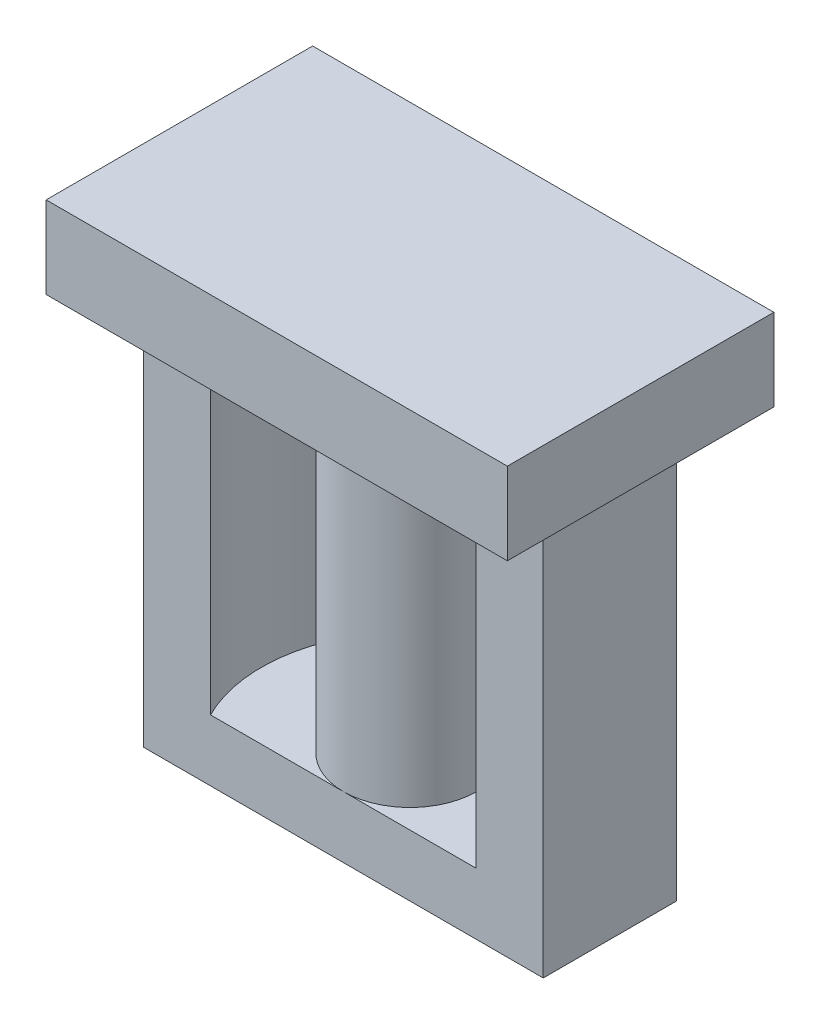
ISO-10303-21;
HEADER;
FILE_DESCRIPTION(('STEP AP214'),'2;1');
FILE_NAME('part.step','',(''),(''),'','','');
FILE_SCHEMA(('AUTOMOTIVE_DESIGN { 1 0 10303 214 1 1 1 1 }'));
ENDSEC;
DATA;
#1=APPLICATION_CONTEXT('core data for automotive mechanical design processes');
#2=APPLICATION_PROTOCOL_DEFINITION('international standard','automotive_design',2000,#1);
#3=PRODUCT_CONTEXT('',#1,'mechanical');
#4=PRODUCT('Part','Part','',(#3));
#5=PRODUCT_RELATED_PRODUCT_CATEGORY('part','',(#4));
#6=PRODUCT_DEFINITION_FORMATION('','',#4);
#7=PRODUCT_DEFINITION_CONTEXT('part definition',#1,'design');
#8=PRODUCT_DEFINITION('design','',#6,#7);
#9=PRODUCT_DEFINITION_SHAPE('','',#8);
#10=(LENGTH_UNIT() NAMED_UNIT(*) SI_UNIT(.MILLI.,.METRE.));
#11=(NAMED_UNIT(*) PLANE_ANGLE_UNIT() SI_UNIT($,.RADIAN.));
#12=(NAMED_UNIT(*) SI_UNIT($,.STERADIAN.) SOLID_ANGLE_UNIT());
#13=UNCERTAINTY_MEASURE_WITH_UNIT(LENGTH_MEASURE(1.E-05),#10,'distance_accuracy_value','');
#14=(GEOMETRIC_REPRESENTATION_CONTEXT(3) GLOBAL_UNCERTAINTY_ASSIGNED_CONTEXT((#13)) GLOBAL_UNIT_ASSIGNED_CONTEXT((#10,
#11,#12)) REPRESENTATION_CONTEXT('',''));
#15=CARTESIAN_POINT('',(0.,0.,0.));
#16=DIRECTION('',(0.,0.,1.));
#17=DIRECTION('',(1.,0.,0.));
#18=AXIS2_PLACEMENT_3D('',#15,#16,#17);
#19=CARTESIAN_POINT('',(0.,0.,0.));
#20=DIRECTION('',(0.,-1.,0.));
#21=DIRECTION('',(0.,0.,-1.));
#22=AXIS2_PLACEMENT_3D('',#19,#20,#21);
#23=PLANE('',#22);
#24=CARTESIAN_POINT('',(19.5,0.,-6.5));
#25=DIRECTION('',(0.,-1.,0.));
#26=DIRECTION('',(0.,0.,-1.));
#27=AXIS2_PLACEMENT_3D('',#24,#25,#26);
#28=CIRCLE('',#27,6.50000000000001);
#29=CARTESIAN_POINT('',(19.5,0.,-13.));
#30=VERTEX_POINT('',#29);
#31=CARTESIAN_POINT('',(19.5,0.,0.));
#32=VERTEX_POINT('',#31);
#33=EDGE_CURVE('E11',#30,#32,#28,.F.);
#34=ORIENTED_EDGE('',*,*,#33,.F.);
#35=DIRECTION('',(1.,0.,0.));
#36=VECTOR('',#35,1.);
#37=CARTESIAN_POINT('',(0.,0.,-13.));
#38=LINE('',#37,#36);
#39=CARTESIAN_POINT('',(6.53851860318428,0.,-13.));
#40=VERTEX_POINT('',#39);
#41=EDGE_CURVE('E219',#40,#30,#38,.T.);
#42=ORIENTED_EDGE('',*,*,#41,.F.);
#43=CARTESIAN_POINT('',(19.5,0.,-6.5));
#44=DIRECTION('',(0.,1.,0.));
#45=DIRECTION('',(0.,0.,1.));
#46=AXIS2_PLACEMENT_3D('',#43,#44,#45);
#47=CIRCLE('',#46,14.5);
#48=CARTESIAN_POINT('',(6.53851860318428,0.,0.));
#49=VERTEX_POINT('',#48);
#50=EDGE_CURVE('E226',#40,#49,#47,.T.);
#51=ORIENTED_EDGE('',*,*,#50,.T.);
#52=DIRECTION('',(-1.,0.,0.));
#53=VECTOR('',#52,1.);
#54=CARTESIAN_POINT('',(0.,0.,0.));
#55=LINE('',#54,#53);
#56=EDGE_CURVE('E221',#32,#49,#55,.T.);
#57=ORIENTED_EDGE('',*,*,#56,.F.);
#58=EDGE_LOOP('',(#34,#42,#51,#57));
#59=FACE_BOUND('',#58,.T.);
#60=ADVANCED_FACE('F38',(#59),#23,.F.);
#61=CARTESIAN_POINT('',(19.5,14.,-6.5));
#62=DIRECTION('',(0.,-1.,0.));
#63=DIRECTION('',(0.,0.,-1.));
#64=AXIS2_PLACEMENT_3D('',#61,#62,#63);
#65=CYLINDRICAL_SURFACE('',#64,14.5);
#66=ORIENTED_EDGE('',*,*,#50,.F.);
#67=DIRECTION('',(0.,-1.,0.));
#68=VECTOR('',#67,1.);
#69=CARTESIAN_POINT('',(6.53851860318428,14.,-13.));
#70=LINE('',#69,#68);
#71=CARTESIAN_POINT('',(6.53851860318428,28.,-13.));
#72=VERTEX_POINT('',#71);
#73=EDGE_CURVE('E46',#72,#40,#70,.T.);
#74=ORIENTED_EDGE('',*,*,#73,.F.);
#75=CARTESIAN_POINT('',(19.5,28.,-6.5));
#76=DIRECTION('',(0.,-1.,0.));
#77=DIRECTION('',(0.,0.,1.));
#78=AXIS2_PLACEMENT_3D('',#75,#76,#77);
#79=CIRCLE('',#78,14.5);
#80=CARTESIAN_POINT('',(6.53851860318428,28.,0.));
#81=VERTEX_POINT('',#80);
#82=EDGE_CURVE('E189',#81,#72,#79,.T.);
#83=ORIENTED_EDGE('',*,*,#82,.F.);
#84=DIRECTION('',(0.,-1.,0.));
#85=VECTOR('',#84,1.);
#86=CARTESIAN_POINT('',(6.53851860318428,14.,0.));
#87=LINE('',#86,#85);
#88=EDGE_CURVE('E229',#81,#49,#87,.T.);
#89=ORIENTED_EDGE('',*,*,#88,.T.);
#90=EDGE_LOOP('',(#66,#74,#83,#89));
#91=FACE_BOUND('',#90,.T.);
#92=ADVANCED_FACE('F40',(#91),#65,.F.);
#93=CARTESIAN_POINT('',(0.,14.,-13.));
#94=DIRECTION('',(0.,0.,-1.));
#95=DIRECTION('',(-1.,0.,0.));
#96=AXIS2_PLACEMENT_3D('',#93,#94,#95);
#97=PLANE('',#96);
#98=DIRECTION('',(0.,-1.,0.));
#99=VECTOR('',#98,1.);
#100=CARTESIAN_POINT('',(32.4614813968157,14.,-13.));
#101=LINE('',#100,#99);
#102=CARTESIAN_POINT('',(32.4614813968157,28.,-13.));
#103=VERTEX_POINT('',#102);
#104=CARTESIAN_POINT('',(32.4614813968157,0.,-13.));
#105=VERTEX_POINT('',#104);
#106=EDGE_CURVE('E200',#103,#105,#101,.T.);
#107=ORIENTED_EDGE('',*,*,#106,.F.);
#108=DIRECTION('',(-1.,0.,0.));
#109=VECTOR('',#108,1.);
#110=CARTESIAN_POINT('',(0.,28.,-13.));
#111=LINE('',#110,#109);
#112=CARTESIAN_POINT('',(19.5,28.,-13.));
#113=VERTEX_POINT('',#112);
#114=EDGE_CURVE('E177',#103,#113,#111,.T.);
#115=ORIENTED_EDGE('',*,*,#114,.T.);
#116=EDGE_CURVE('E186',#113,#72,#111,.T.);
#117=ORIENTED_EDGE('',*,*,#116,.T.);
#118=ORIENTED_EDGE('',*,*,#73,.T.);
#119=ORIENTED_EDGE('',*,*,#41,.T.);
#120=EDGE_CURVE('E207',#30,#105,#38,.T.);
#121=ORIENTED_EDGE('',*,*,#120,.T.);
#122=EDGE_LOOP('',(#107,#115,#117,#118,#119,#121));
#123=FACE_BOUND('',#122,.T.);
#124=DIRECTION('',(-1.,0.,0.));
#125=VECTOR('',#124,1.);
#126=CARTESIAN_POINT('',(0.,34.,-13.));
#127=LINE('',#126,#125);
#128=CARTESIAN_POINT('',(39.,34.,-13.));
#129=VERTEX_POINT('',#128);
#130=CARTESIAN_POINT('',(0.,34.,-13.));
#131=VERTEX_POINT('',#130);
#132=EDGE_CURVE('E183',#129,#131,#127,.T.);
#133=ORIENTED_EDGE('',*,*,#132,.F.);
#134=DIRECTION('',(0.,1.,0.));
#135=VECTOR('',#134,1.);
#136=CARTESIAN_POINT('',(39.,-6.,-13.));
#137=LINE('',#136,#135);
#138=CARTESIAN_POINT('',(39.,-6.,-13.));
#139=VERTEX_POINT('',#138);
#140=EDGE_CURVE('E224',#139,#129,#137,.T.);
#141=ORIENTED_EDGE('',*,*,#140,.F.);
#142=DIRECTION('',(1.,0.,0.));
#143=VECTOR('',#142,1.);
#144=CARTESIAN_POINT('',(0.,-6.,-13.));
#145=LINE('',#144,#143);
#146=CARTESIAN_POINT('',(0.,-6.,-13.));
#147=VERTEX_POINT('',#146);
#148=EDGE_CURVE('E211',#147,#139,#145,.T.);
#149=ORIENTED_EDGE('',*,*,#148,.F.);
#150=DIRECTION('',(0.,-1.,0.));
#151=VECTOR('',#150,1.);
#152=CARTESIAN_POINT('',(0.,14.,-13.));
#153=LINE('',#152,#151);
#154=EDGE_CURVE('E234',#131,#147,#153,.T.);
#155=ORIENTED_EDGE('',*,*,#154,.F.);
#156=EDGE_LOOP('',(#133,#141,#149,#155));
#157=FACE_BOUND('',#156,.T.);
#158=ADVANCED_FACE('F238',(#123,#157),#97,.T.);
#159=CARTESIAN_POINT('',(0.,14.,0.));
#160=DIRECTION('',(-1.,0.,0.));
#161=DIRECTION('',(0.,0.,1.));
#162=AXIS2_PLACEMENT_3D('',#159,#160,#161);
#163=PLANE('',#162);
#164=ORIENTED_EDGE('',*,*,#154,.T.);
#165=DIRECTION('',(0.,0.,-1.));
#166=VECTOR('',#165,1.);
#167=CARTESIAN_POINT('',(0.,-6.,0.));
#168=LINE('',#167,#166);
#169=CARTESIAN_POINT('',(0.,-6.,0.));
#170=VERTEX_POINT('',#169);
#171=EDGE_CURVE('E208',#170,#147,#168,.T.);
#172=ORIENTED_EDGE('',*,*,#171,.F.);
#173=DIRECTION('',(0.,-1.,0.));
#174=VECTOR('',#173,1.);
#175=CARTESIAN_POINT('',(0.,14.,0.));
#176=LINE('',#175,#174);
#177=CARTESIAN_POINT('',(0.,34.,0.));
#178=VERTEX_POINT('',#177);
#179=EDGE_CURVE('E232',#178,#170,#176,.T.);
#180=ORIENTED_EDGE('',*,*,#179,.F.);
#181=DIRECTION('',(0.,0.,1.));
#182=VECTOR('',#181,1.);
#183=CARTESIAN_POINT('',(0.,34.,-13.));
#184=LINE('',#183,#182);
#185=EDGE_CURVE('E173',#131,#178,#184,.T.);
#186=ORIENTED_EDGE('',*,*,#185,.F.);
#187=EDGE_LOOP('',(#164,#172,#180,#186));
#188=FACE_BOUND('',#187,.T.);
#189=ADVANCED_FACE('F289',(#188),#163,.T.);
#190=CARTESIAN_POINT('',(0.,14.,0.));
#191=DIRECTION('',(0.,0.,-1.));
#192=DIRECTION('',(-1.,0.,0.));
#193=AXIS2_PLACEMENT_3D('',#190,#191,#192);
#194=PLANE('',#193);
#195=DIRECTION('',(0.,1.,0.));
#196=VECTOR('',#195,1.);
#197=CARTESIAN_POINT('',(39.,-6.,0.));
#198=LINE('',#197,#196);
#199=CARTESIAN_POINT('',(39.,-6.,0.));
#200=VERTEX_POINT('',#199);
#201=CARTESIAN_POINT('',(39.,34.,0.));
#202=VERTEX_POINT('',#201);
#203=EDGE_CURVE('E218',#200,#202,#198,.T.);
#204=ORIENTED_EDGE('',*,*,#203,.T.);
#205=DIRECTION('',(1.,0.,0.));
#206=VECTOR('',#205,1.);
#207=CARTESIAN_POINT('',(0.,34.,0.));
#208=LINE('',#207,#206);
#209=EDGE_CURVE('E176',#178,#202,#208,.T.);
#210=ORIENTED_EDGE('',*,*,#209,.F.);
#211=ORIENTED_EDGE('',*,*,#179,.T.);
#212=DIRECTION('',(-1.,0.,0.));
#213=VECTOR('',#212,1.);
#214=CARTESIAN_POINT('',(0.,-6.,0.));
#215=LINE('',#214,#213);
#216=EDGE_CURVE('E215',#200,#170,#215,.T.);
#217=ORIENTED_EDGE('',*,*,#216,.F.);
#218=EDGE_LOOP('',(#204,#210,#211,#217));
#219=FACE_BOUND('',#218,.T.);
#220=DIRECTION('',(1.,0.,0.));
#221=VECTOR('',#220,1.);
#222=CARTESIAN_POINT('',(0.,28.,0.));
#223=LINE('',#222,#221);
#224=CARTESIAN_POINT('',(19.5,28.,0.));
#225=VERTEX_POINT('',#224);
#226=CARTESIAN_POINT('',(32.4614813968157,28.,0.));
#227=VERTEX_POINT('',#226);
#228=EDGE_CURVE('E164',#225,#227,#223,.T.);
#229=ORIENTED_EDGE('',*,*,#228,.T.);
#230=DIRECTION('',(0.,-1.,0.));
#231=VECTOR('',#230,1.);
#232=CARTESIAN_POINT('',(32.4614813968157,14.,0.));
#233=LINE('',#232,#231);
#234=CARTESIAN_POINT('',(32.4614813968157,0.,0.));
#235=VERTEX_POINT('',#234);
#236=EDGE_CURVE('E202',#227,#235,#233,.T.);
#237=ORIENTED_EDGE('',*,*,#236,.T.);
#238=EDGE_CURVE('E60',#235,#32,#55,.T.);
#239=ORIENTED_EDGE('',*,*,#238,.T.);
#240=ORIENTED_EDGE('',*,*,#56,.T.);
#241=ORIENTED_EDGE('',*,*,#88,.F.);
#242=EDGE_CURVE('E167',#81,#225,#223,.T.);
#243=ORIENTED_EDGE('',*,*,#242,.T.);
#244=EDGE_LOOP('',(#229,#237,#239,#240,#241,#243));
#245=FACE_BOUND('',#244,.T.);
#246=ADVANCED_FACE('F264',(#219,#245),#194,.F.);
#247=ORIENTED_EDGE('',*,*,#238,.F.);
#248=CARTESIAN_POINT('',(19.5,0.,-6.5));
#249=DIRECTION('',(0.,1.,0.));
#250=DIRECTION('',(0.,0.,1.));
#251=AXIS2_PLACEMENT_3D('',#248,#249,#250);
#252=CIRCLE('',#251,14.5);
#253=EDGE_CURVE('E197',#235,#105,#252,.T.);
#254=ORIENTED_EDGE('',*,*,#253,.T.);
#255=ORIENTED_EDGE('',*,*,#120,.F.);
#256=CARTESIAN_POINT('',(19.5,0.,-6.5));
#257=DIRECTION('',(0.,1.,0.));
#258=DIRECTION('',(0.,0.,1.));
#259=AXIS2_PLACEMENT_3D('',#256,#257,#258);
#260=CIRCLE('',#259,6.50000000000001);
#261=EDGE_CURVE('E204',#32,#30,#260,.T.);
#262=ORIENTED_EDGE('',*,*,#261,.F.);
#263=EDGE_LOOP('',(#247,#254,#255,#262));
#264=FACE_BOUND('',#263,.T.);
#265=ADVANCED_FACE('F253',(#264),#23,.F.);
#266=CARTESIAN_POINT('',(39.,-6.,0.));
#267=DIRECTION('',(-1.,0.,0.));
#268=DIRECTION('',(0.,0.,1.));
#269=AXIS2_PLACEMENT_3D('',#266,#267,#268);
#270=PLANE('',#269);
#271=ORIENTED_EDGE('',*,*,#140,.T.);
#272=DIRECTION('',(0.,0.,-1.));
#273=VECTOR('',#272,1.);
#274=CARTESIAN_POINT('',(39.,34.,-13.));
#275=LINE('',#274,#273);
#276=EDGE_CURVE('E180',#202,#129,#275,.T.);
#277=ORIENTED_EDGE('',*,*,#276,.F.);
#278=ORIENTED_EDGE('',*,*,#203,.F.);
#279=DIRECTION('',(0.,0.,1.));
#280=VECTOR('',#279,1.);
#281=CARTESIAN_POINT('',(39.,-6.,0.));
#282=LINE('',#281,#280);
#283=EDGE_CURVE('E213',#139,#200,#282,.T.);
#284=ORIENTED_EDGE('',*,*,#283,.F.);
#285=EDGE_LOOP('',(#271,#277,#278,#284));
#286=FACE_BOUND('',#285,.T.);
#287=ADVANCED_FACE('F283',(#286),#270,.F.);
#288=CARTESIAN_POINT('',(0.,-6.,0.));
#289=DIRECTION('',(0.,-1.,0.));
#290=DIRECTION('',(0.,0.,-1.));
#291=AXIS2_PLACEMENT_3D('',#288,#289,#290);
#292=PLANE('',#291);
#293=ORIENTED_EDGE('',*,*,#171,.T.);
#294=ORIENTED_EDGE('',*,*,#148,.T.);
#295=ORIENTED_EDGE('',*,*,#283,.T.);
#296=ORIENTED_EDGE('',*,*,#216,.T.);
#297=EDGE_LOOP('',(#293,#294,#295,#296));
#298=FACE_BOUND('',#297,.T.);
#299=ADVANCED_FACE('F273',(#298),#292,.T.);
#300=CARTESIAN_POINT('',(19.5,14.,-6.5));
#301=DIRECTION('',(0.,-1.,0.));
#302=DIRECTION('',(0.,0.,-1.));
#303=AXIS2_PLACEMENT_3D('',#300,#301,#302);
#304=CYLINDRICAL_SURFACE('',#303,6.50000000000001);
#305=ORIENTED_EDGE('',*,*,#261,.T.);
#306=ORIENTED_EDGE('',*,*,#33,.T.);
#307=EDGE_LOOP('',(#305,#306));
#308=FACE_BOUND('',#307,.T.);
#309=CARTESIAN_POINT('',(19.5,28.,-6.5));
#310=DIRECTION('',(0.,1.,0.));
#311=DIRECTION('',(0.,0.,1.));
#312=AXIS2_PLACEMENT_3D('',#309,#310,#311);
#313=CIRCLE('',#312,6.50000000000001);
#314=EDGE_CURVE('E192',#225,#113,#313,.T.);
#315=ORIENTED_EDGE('',*,*,#314,.F.);
#316=EDGE_CURVE('E52',#113,#225,#313,.T.);
#317=ORIENTED_EDGE('',*,*,#316,.F.);
#318=EDGE_LOOP('',(#315,#317));
#319=FACE_BOUND('',#318,.T.);
#320=ADVANCED_FACE('F251',(#308,#319),#304,.T.);
#321=CARTESIAN_POINT('',(19.5,14.,-6.5));
#322=DIRECTION('',(0.,-1.,0.));
#323=DIRECTION('',(0.,0.,-1.));
#324=AXIS2_PLACEMENT_3D('',#321,#322,#323);
#325=CYLINDRICAL_SURFACE('',#324,14.5);
#326=ORIENTED_EDGE('',*,*,#253,.F.);
#327=ORIENTED_EDGE('',*,*,#236,.F.);
#328=CARTESIAN_POINT('',(19.5,28.,-6.5));
#329=DIRECTION('',(0.,-1.,0.));
#330=DIRECTION('',(0.,0.,1.));
#331=AXIS2_PLACEMENT_3D('',#328,#329,#330);
#332=CIRCLE('',#331,14.5);
#333=EDGE_CURVE('E194',#103,#227,#332,.T.);
#334=ORIENTED_EDGE('',*,*,#333,.F.);
#335=ORIENTED_EDGE('',*,*,#106,.T.);
#336=EDGE_LOOP('',(#326,#327,#334,#335));
#337=FACE_BOUND('',#336,.T.);
#338=ADVANCED_FACE('F265',(#337),#325,.F.);
#339=CARTESIAN_POINT('',(0.,28.,0.));
#340=DIRECTION('',(0.,1.,0.));
#341=DIRECTION('',(0.,0.,1.));
#342=AXIS2_PLACEMENT_3D('',#339,#340,#341);
#343=PLANE('',#342);
#344=ORIENTED_EDGE('',*,*,#228,.F.);
#345=ORIENTED_EDGE('',*,*,#314,.T.);
#346=ORIENTED_EDGE('',*,*,#114,.F.);
#347=ORIENTED_EDGE('',*,*,#333,.T.);
#348=EDGE_LOOP('',(#344,#345,#346,#347));
#349=FACE_BOUND('',#348,.T.);
#350=ADVANCED_FACE('F259',(#349),#343,.F.);
#351=ORIENTED_EDGE('',*,*,#116,.F.);
#352=ORIENTED_EDGE('',*,*,#316,.T.);
#353=ORIENTED_EDGE('',*,*,#242,.F.);
#354=ORIENTED_EDGE('',*,*,#82,.T.);
#355=EDGE_LOOP('',(#351,#352,#353,#354));
#356=FACE_BOUND('',#355,.T.);
#357=ADVANCED_FACE('F262',(#356),#343,.F.);
#358=CARTESIAN_POINT('',(0.,34.,0.));
#359=DIRECTION('',(0.,1.,0.));
#360=DIRECTION('',(0.,0.,1.));
#361=AXIS2_PLACEMENT_3D('',#358,#359,#360);
#362=PLANE('',#361);
#363=DIRECTION('',(0.,0.,1.));
#364=VECTOR('',#363,1.);
#365=CARTESIAN_POINT('',(-3.00000000000001,34.,-19.5));
#366=LINE('',#365,#364);
#367=CARTESIAN_POINT('',(-3.00000000000001,34.,-19.5));
#368=VERTEX_POINT('',#367);
#369=CARTESIAN_POINT('',(-3.,34.,6.5));
#370=VERTEX_POINT('',#369);
#371=EDGE_CURVE('E163',#368,#370,#366,.T.);
#372=ORIENTED_EDGE('',*,*,#371,.F.);
#373=DIRECTION('',(1.,0.,0.));
#374=VECTOR('',#373,1.);
#375=CARTESIAN_POINT('',(-3.00000000000001,34.,-19.5));
#376=LINE('',#375,#374);
#377=CARTESIAN_POINT('',(42.,34.,-19.5));
#378=VERTEX_POINT('',#377);
#379=EDGE_CURVE('E159',#368,#378,#376,.T.);
#380=ORIENTED_EDGE('',*,*,#379,.T.);
#381=DIRECTION('',(0.,0.,1.));
#382=VECTOR('',#381,1.);
#383=CARTESIAN_POINT('',(42.,34.,-19.5));
#384=LINE('',#383,#382);
#385=CARTESIAN_POINT('',(42.,34.,6.5));
#386=VERTEX_POINT('',#385);
#387=EDGE_CURVE('E387',#378,#386,#384,.T.);
#388=ORIENTED_EDGE('',*,*,#387,.T.);
#389=DIRECTION('',(1.,0.,0.));
#390=VECTOR('',#389,1.);
#391=CARTESIAN_POINT('',(-3.,34.,6.5));
#392=LINE('',#391,#390);
#393=EDGE_CURVE('E389',#370,#386,#392,.T.);
#394=ORIENTED_EDGE('',*,*,#393,.F.);
#395=EDGE_LOOP('',(#372,#380,#388,#394));
#396=FACE_BOUND('',#395,.T.);
#397=ORIENTED_EDGE('',*,*,#132,.T.);
#398=ORIENTED_EDGE('',*,*,#185,.T.);
#399=ORIENTED_EDGE('',*,*,#209,.T.);
#400=ORIENTED_EDGE('',*,*,#276,.T.);
#401=EDGE_LOOP('',(#397,#398,#399,#400));
#402=FACE_BOUND('',#401,.T.);
#403=ADVANCED_FACE('F327',(#396,#402),#362,.F.);
#404=CARTESIAN_POINT('',(-3.00000000000001,42.,-19.5));
#405=DIRECTION('',(1.,0.,0.));
#406=DIRECTION('',(0.,0.,-1.));
#407=AXIS2_PLACEMENT_3D('',#404,#405,#406);
#408=PLANE('',#407);
#409=ORIENTED_EDGE('',*,*,#371,.T.);
#410=DIRECTION('',(0.,-1.,0.));
#411=VECTOR('',#410,1.);
#412=CARTESIAN_POINT('',(-3.,42.,6.5));
#413=LINE('',#412,#411);
#414=CARTESIAN_POINT('',(-3.,42.,6.5));
#415=VERTEX_POINT('',#414);
#416=EDGE_CURVE('E144',#415,#370,#413,.T.);
#417=ORIENTED_EDGE('',*,*,#416,.F.);
#418=DIRECTION('',(0.,0.,1.));
#419=VECTOR('',#418,1.);
#420=CARTESIAN_POINT('',(-3.00000000000001,42.,-19.5));
#421=LINE('',#420,#419);
#422=CARTESIAN_POINT('',(-3.00000000000001,42.,-19.5));
#423=VERTEX_POINT('',#422);
#424=EDGE_CURVE('E151',#423,#415,#421,.T.);
#425=ORIENTED_EDGE('',*,*,#424,.F.);
#426=DIRECTION('',(0.,-1.,0.));
#427=VECTOR('',#426,1.);
#428=CARTESIAN_POINT('',(-3.00000000000001,42.,-19.5));
#429=LINE('',#428,#427);
#430=EDGE_CURVE('E384',#423,#368,#429,.T.);
#431=ORIENTED_EDGE('',*,*,#430,.T.);
#432=EDGE_LOOP('',(#409,#417,#425,#431));
#433=FACE_BOUND('',#432,.T.);
#434=ADVANCED_FACE('F161',(#433),#408,.F.);
#435=CARTESIAN_POINT('',(-3.,42.,6.5));
#436=DIRECTION('',(0.,0.,-1.));
#437=DIRECTION('',(-1.,0.,0.));
#438=AXIS2_PLACEMENT_3D('',#435,#436,#437);
#439=PLANE('',#438);
#440=ORIENTED_EDGE('',*,*,#393,.T.);
#441=DIRECTION('',(0.,-1.,0.));
#442=VECTOR('',#441,1.);
#443=CARTESIAN_POINT('',(42.,42.,6.5));
#444=LINE('',#443,#442);
#445=CARTESIAN_POINT('',(42.,42.,6.5));
#446=VERTEX_POINT('',#445);
#447=EDGE_CURVE('E146',#446,#386,#444,.T.);
#448=ORIENTED_EDGE('',*,*,#447,.F.);
#449=DIRECTION('',(1.,0.,0.));
#450=VECTOR('',#449,1.);
#451=CARTESIAN_POINT('',(-3.,42.,6.5));
#452=LINE('',#451,#450);
#453=EDGE_CURVE('E139',#415,#446,#452,.T.);
#454=ORIENTED_EDGE('',*,*,#453,.F.);
#455=ORIENTED_EDGE('',*,*,#416,.T.);
#456=EDGE_LOOP('',(#440,#448,#454,#455));
#457=FACE_BOUND('',#456,.T.);
#458=ADVANCED_FACE('F142',(#457),#439,.F.);
#459=CARTESIAN_POINT('',(42.,42.,-19.5));
#460=DIRECTION('',(1.,0.,0.));
#461=DIRECTION('',(0.,0.,-1.));
#462=AXIS2_PLACEMENT_3D('',#459,#460,#461);
#463=PLANE('',#462);
#464=ORIENTED_EDGE('',*,*,#387,.F.);
#465=DIRECTION('',(0.,-1.,0.));
#466=VECTOR('',#465,1.);
#467=CARTESIAN_POINT('',(42.,42.,-19.5));
#468=LINE('',#467,#466);
#469=CARTESIAN_POINT('',(42.,42.,-19.5));
#470=VERTEX_POINT('',#469);
#471=EDGE_CURVE('E169',#470,#378,#468,.T.);
#472=ORIENTED_EDGE('',*,*,#471,.F.);
#473=DIRECTION('',(0.,0.,1.));
#474=VECTOR('',#473,1.);
#475=CARTESIAN_POINT('',(42.,42.,-19.5));
#476=LINE('',#475,#474);
#477=EDGE_CURVE('E150',#470,#446,#476,.T.);
#478=ORIENTED_EDGE('',*,*,#477,.T.);
#479=ORIENTED_EDGE('',*,*,#447,.T.);
#480=EDGE_LOOP('',(#464,#472,#478,#479));
#481=FACE_BOUND('',#480,.T.);
#482=ADVANCED_FACE('F351',(#481),#463,.T.);
#483=CARTESIAN_POINT('',(-3.00000000000001,42.,-19.5));
#484=DIRECTION('',(0.,0.,-1.));
#485=DIRECTION('',(-1.,0.,0.));
#486=AXIS2_PLACEMENT_3D('',#483,#484,#485);
#487=PLANE('',#486);
#488=ORIENTED_EDGE('',*,*,#379,.F.);
#489=ORIENTED_EDGE('',*,*,#430,.F.);
#490=DIRECTION('',(1.,0.,0.));
#491=VECTOR('',#490,1.);
#492=CARTESIAN_POINT('',(-3.00000000000001,42.,-19.5));
#493=LINE('',#492,#491);
#494=EDGE_CURVE('E157',#423,#470,#493,.T.);
#495=ORIENTED_EDGE('',*,*,#494,.T.);
#496=ORIENTED_EDGE('',*,*,#471,.T.);
#497=EDGE_LOOP('',(#488,#489,#495,#496));
#498=FACE_BOUND('',#497,.T.);
#499=ADVANCED_FACE('F360',(#498),#487,.T.);
#500=CARTESIAN_POINT('',(0.,42.,0.));
#501=DIRECTION('',(0.,1.,0.));
#502=DIRECTION('',(0.,0.,1.));
#503=AXIS2_PLACEMENT_3D('',#500,#501,#502);
#504=PLANE('',#503);
#505=ORIENTED_EDGE('',*,*,#424,.T.);
#506=ORIENTED_EDGE('',*,*,#453,.T.);
#507=ORIENTED_EDGE('',*,*,#477,.F.);
#508=ORIENTED_EDGE('',*,*,#494,.F.);
#509=EDGE_LOOP('',(#505,#506,#507,#508));
#510=FACE_BOUND('',#509,.T.);
#511=ADVANCED_FACE('F155',(#510),#504,.T.);
#512=CLOSED_SHELL('',(#60,#92,#158,#189,#246,#265,#287,#299,#320,#338,#350,#357,#403,#434,#458,
#482,#499,#511));
#513=MANIFOLD_SOLID_BREP('B2',#512);
#514=ADVANCED_BREP_SHAPE_REPRESENTATION('',(#18,#513),#14);
#515=SHAPE_DEFINITION_REPRESENTATION(#9,#514);
ENDSEC;
END-ISO-10303-21;
